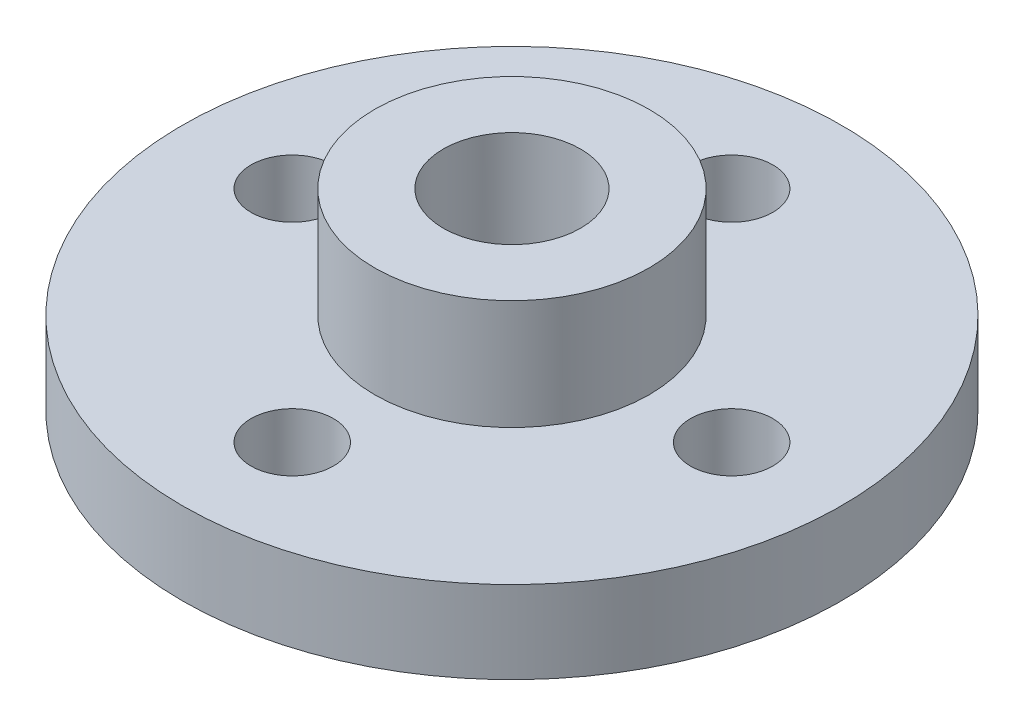
ISO-10303-21;
HEADER;
FILE_DESCRIPTION(('STEP AP214'),'2;1');
FILE_NAME('part.step','',(''),(''),'','','');
FILE_SCHEMA(('AUTOMOTIVE_DESIGN { 1 0 10303 214 1 1 1 1 }'));
ENDSEC;
DATA;
#1=APPLICATION_CONTEXT('core data for automotive mechanical design processes');
#2=APPLICATION_PROTOCOL_DEFINITION('international standard','automotive_design',2000,#1);
#3=PRODUCT_CONTEXT('',#1,'mechanical');
#4=PRODUCT('Part','Part','',(#3));
#5=PRODUCT_RELATED_PRODUCT_CATEGORY('part','',(#4));
#6=PRODUCT_DEFINITION_FORMATION('','',#4);
#7=PRODUCT_DEFINITION_CONTEXT('part definition',#1,'design');
#8=PRODUCT_DEFINITION('design','',#6,#7);
#9=PRODUCT_DEFINITION_SHAPE('','',#8);
#10=(LENGTH_UNIT() NAMED_UNIT(*) SI_UNIT(.MILLI.,.METRE.));
#11=(NAMED_UNIT(*) PLANE_ANGLE_UNIT() SI_UNIT($,.RADIAN.));
#12=(NAMED_UNIT(*) SI_UNIT($,.STERADIAN.) SOLID_ANGLE_UNIT());
#13=UNCERTAINTY_MEASURE_WITH_UNIT(LENGTH_MEASURE(1.E-05),#10,'distance_accuracy_value','');
#14=(GEOMETRIC_REPRESENTATION_CONTEXT(3) GLOBAL_UNCERTAINTY_ASSIGNED_CONTEXT((#13)) GLOBAL_UNIT_ASSIGNED_CONTEXT((#10,
#11,#12)) REPRESENTATION_CONTEXT('',''));
#15=CARTESIAN_POINT('',(0.,0.,0.));
#16=DIRECTION('',(0.,0.,1.));
#17=DIRECTION('',(1.,0.,0.));
#18=AXIS2_PLACEMENT_3D('',#15,#16,#17);
#19=CARTESIAN_POINT('',(0.,3.,0.));
#20=DIRECTION('',(0.,-1.,0.));
#21=DIRECTION('',(0.,0.,-1.));
#22=AXIS2_PLACEMENT_3D('',#19,#20,#21);
#23=CYLINDRICAL_SURFACE('',#22,12.);
#24=CARTESIAN_POINT('',(0.,3.,0.));
#25=DIRECTION('',(0.,1.,0.));
#26=DIRECTION('',(0.,0.,1.));
#27=AXIS2_PLACEMENT_3D('',#24,#25,#26);
#28=CIRCLE('',#27,12.);
#29=CARTESIAN_POINT('',(0.,3.,12.));
#30=VERTEX_POINT('',#29);
#31=EDGE_CURVE('E10',#30,#30,#28,.T.);
#32=ORIENTED_EDGE('',*,*,#31,.F.);
#33=EDGE_LOOP('',(#32));
#34=FACE_BOUND('',#33,.T.);
#35=CARTESIAN_POINT('',(0.,0.,0.));
#36=DIRECTION('',(0.,1.,0.));
#37=DIRECTION('',(0.,0.,1.));
#38=AXIS2_PLACEMENT_3D('',#35,#36,#37);
#39=CIRCLE('',#38,12.);
#40=CARTESIAN_POINT('',(0.,0.,12.));
#41=VERTEX_POINT('',#40);
#42=EDGE_CURVE('E38',#41,#41,#39,.T.);
#43=ORIENTED_EDGE('',*,*,#42,.T.);
#44=EDGE_LOOP('',(#43));
#45=FACE_BOUND('',#44,.T.);
#46=ADVANCED_FACE('F35',(#34,#45),#23,.T.);
#47=CARTESIAN_POINT('',(0.,3.,0.));
#48=DIRECTION('',(0.,1.,0.));
#49=DIRECTION('',(0.,0.,1.));
#50=AXIS2_PLACEMENT_3D('',#47,#48,#49);
#51=PLANE('',#50);
#52=CARTESIAN_POINT('',(-8.,3.,0.));
#53=DIRECTION('',(0.,1.,0.));
#54=DIRECTION('',(0.,0.,1.));
#55=AXIS2_PLACEMENT_3D('',#52,#53,#54);
#56=CIRCLE('',#55,1.5);
#57=CARTESIAN_POINT('',(-8.,3.,1.5));
#58=VERTEX_POINT('',#57);
#59=EDGE_CURVE('E77',#58,#58,#56,.F.);
#60=ORIENTED_EDGE('',*,*,#59,.T.);
#61=EDGE_LOOP('',(#60));
#62=FACE_BOUND('',#61,.T.);
#63=CARTESIAN_POINT('',(0.,3.,8.));
#64=DIRECTION('',(0.,1.,0.));
#65=DIRECTION('',(0.,0.,1.));
#66=AXIS2_PLACEMENT_3D('',#63,#64,#65);
#67=CIRCLE('',#66,1.5);
#68=CARTESIAN_POINT('',(0.,3.,9.5));
#69=VERTEX_POINT('',#68);
#70=EDGE_CURVE('E71',#69,#69,#67,.F.);
#71=ORIENTED_EDGE('',*,*,#70,.T.);
#72=EDGE_LOOP('',(#71));
#73=FACE_BOUND('',#72,.T.);
#74=CARTESIAN_POINT('',(8.,3.,0.));
#75=DIRECTION('',(0.,1.,0.));
#76=DIRECTION('',(0.,0.,1.));
#77=AXIS2_PLACEMENT_3D('',#74,#75,#76);
#78=CIRCLE('',#77,1.5);
#79=CARTESIAN_POINT('',(8.,3.,1.5));
#80=VERTEX_POINT('',#79);
#81=EDGE_CURVE('E65',#80,#80,#78,.F.);
#82=ORIENTED_EDGE('',*,*,#81,.T.);
#83=EDGE_LOOP('',(#82));
#84=FACE_BOUND('',#83,.T.);
#85=CARTESIAN_POINT('',(0.,3.,-8.));
#86=DIRECTION('',(0.,1.,0.));
#87=DIRECTION('',(0.,0.,1.));
#88=AXIS2_PLACEMENT_3D('',#85,#86,#87);
#89=CIRCLE('',#88,1.5);
#90=CARTESIAN_POINT('',(0.,3.,-6.5));
#91=VERTEX_POINT('',#90);
#92=EDGE_CURVE('E59',#91,#91,#89,.F.);
#93=ORIENTED_EDGE('',*,*,#92,.T.);
#94=EDGE_LOOP('',(#93));
#95=FACE_BOUND('',#94,.T.);
#96=CARTESIAN_POINT('',(0.,3.,0.));
#97=DIRECTION('',(0.,1.,0.));
#98=DIRECTION('',(0.,0.,1.));
#99=AXIS2_PLACEMENT_3D('',#96,#97,#98);
#100=CIRCLE('',#99,5.);
#101=CARTESIAN_POINT('',(0.,3.,5.));
#102=VERTEX_POINT('',#101);
#103=EDGE_CURVE('E47',#102,#102,#100,.T.);
#104=ORIENTED_EDGE('',*,*,#103,.F.);
#105=EDGE_LOOP('',(#104));
#106=FACE_BOUND('',#105,.T.);
#107=ORIENTED_EDGE('',*,*,#31,.T.);
#108=EDGE_LOOP('',(#107));
#109=FACE_BOUND('',#108,.T.);
#110=ADVANCED_FACE('F89',(#62,#73,#84,#95,#106,#109),#51,.T.);
#111=CARTESIAN_POINT('',(0.,0.,0.));
#112=DIRECTION('',(0.,1.,0.));
#113=DIRECTION('',(0.,0.,1.));
#114=AXIS2_PLACEMENT_3D('',#111,#112,#113);
#115=PLANE('',#114);
#116=CARTESIAN_POINT('',(-8.,0.,0.));
#117=DIRECTION('',(0.,-1.,0.));
#118=DIRECTION('',(0.,0.,-1.));
#119=AXIS2_PLACEMENT_3D('',#116,#117,#118);
#120=CIRCLE('',#119,1.5);
#121=CARTESIAN_POINT('',(-8.,0.,-1.5));
#122=VERTEX_POINT('',#121);
#123=EDGE_CURVE('E58',#122,#122,#120,.T.);
#124=ORIENTED_EDGE('',*,*,#123,.F.);
#125=EDGE_LOOP('',(#124));
#126=FACE_BOUND('',#125,.T.);
#127=CARTESIAN_POINT('',(0.,0.,8.));
#128=DIRECTION('',(0.,-1.,0.));
#129=DIRECTION('',(0.,0.,-1.));
#130=AXIS2_PLACEMENT_3D('',#127,#128,#129);
#131=CIRCLE('',#130,1.5);
#132=CARTESIAN_POINT('',(0.,0.,6.5));
#133=VERTEX_POINT('',#132);
#134=EDGE_CURVE('E74',#133,#133,#131,.T.);
#135=ORIENTED_EDGE('',*,*,#134,.F.);
#136=EDGE_LOOP('',(#135));
#137=FACE_BOUND('',#136,.T.);
#138=CARTESIAN_POINT('',(8.,0.,0.));
#139=DIRECTION('',(0.,-1.,0.));
#140=DIRECTION('',(0.,0.,-1.));
#141=AXIS2_PLACEMENT_3D('',#138,#139,#140);
#142=CIRCLE('',#141,1.5);
#143=CARTESIAN_POINT('',(8.,0.,-1.5));
#144=VERTEX_POINT('',#143);
#145=EDGE_CURVE('E68',#144,#144,#142,.T.);
#146=ORIENTED_EDGE('',*,*,#145,.F.);
#147=EDGE_LOOP('',(#146));
#148=FACE_BOUND('',#147,.T.);
#149=CARTESIAN_POINT('',(0.,0.,-8.));
#150=DIRECTION('',(0.,-1.,0.));
#151=DIRECTION('',(0.,0.,-1.));
#152=AXIS2_PLACEMENT_3D('',#149,#150,#151);
#153=CIRCLE('',#152,1.5);
#154=CARTESIAN_POINT('',(0.,0.,-9.5));
#155=VERTEX_POINT('',#154);
#156=EDGE_CURVE('E62',#155,#155,#153,.T.);
#157=ORIENTED_EDGE('',*,*,#156,.F.);
#158=EDGE_LOOP('',(#157));
#159=FACE_BOUND('',#158,.T.);
#160=CARTESIAN_POINT('',(0.,0.,0.));
#161=DIRECTION('',(0.,-1.,0.));
#162=DIRECTION('',(0.,0.,-1.));
#163=AXIS2_PLACEMENT_3D('',#160,#161,#162);
#164=CIRCLE('',#163,2.5);
#165=CARTESIAN_POINT('',(0.,0.,-2.5));
#166=VERTEX_POINT('',#165);
#167=EDGE_CURVE('E55',#166,#166,#164,.T.);
#168=ORIENTED_EDGE('',*,*,#167,.F.);
#169=EDGE_LOOP('',(#168));
#170=FACE_BOUND('',#169,.T.);
#171=ORIENTED_EDGE('',*,*,#42,.F.);
#172=EDGE_LOOP('',(#171));
#173=FACE_BOUND('',#172,.T.);
#174=ADVANCED_FACE('F85',(#126,#137,#148,#159,#170,#173),#115,.F.);
#175=CARTESIAN_POINT('',(0.,7.,0.));
#176=DIRECTION('',(0.,1.,0.));
#177=DIRECTION('',(0.,0.,1.));
#178=AXIS2_PLACEMENT_3D('',#175,#176,#177);
#179=PLANE('',#178);
#180=CARTESIAN_POINT('',(0.,7.,0.));
#181=DIRECTION('',(0.,1.,0.));
#182=DIRECTION('',(0.,0.,1.));
#183=AXIS2_PLACEMENT_3D('',#180,#181,#182);
#184=CIRCLE('',#183,5.);
#185=CARTESIAN_POINT('',(0.,7.,5.));
#186=VERTEX_POINT('',#185);
#187=EDGE_CURVE('E45',#186,#186,#184,.T.);
#188=ORIENTED_EDGE('',*,*,#187,.T.);
#189=EDGE_LOOP('',(#188));
#190=FACE_BOUND('',#189,.T.);
#191=CARTESIAN_POINT('',(0.,7.,0.));
#192=DIRECTION('',(0.,1.,0.));
#193=DIRECTION('',(0.,0.,1.));
#194=AXIS2_PLACEMENT_3D('',#191,#192,#193);
#195=CIRCLE('',#194,2.5);
#196=CARTESIAN_POINT('',(0.,7.,2.5));
#197=VERTEX_POINT('',#196);
#198=EDGE_CURVE('E50',#197,#197,#195,.T.);
#199=ORIENTED_EDGE('',*,*,#198,.F.);
#200=EDGE_LOOP('',(#199));
#201=FACE_BOUND('',#200,.T.);
#202=ADVANCED_FACE('F88',(#190,#201),#179,.T.);
#203=CARTESIAN_POINT('',(0.,7.,0.));
#204=DIRECTION('',(0.,-1.,0.));
#205=DIRECTION('',(0.,0.,-1.));
#206=AXIS2_PLACEMENT_3D('',#203,#204,#205);
#207=CYLINDRICAL_SURFACE('',#206,5.);
#208=ORIENTED_EDGE('',*,*,#187,.F.);
#209=EDGE_LOOP('',(#208));
#210=FACE_BOUND('',#209,.T.);
#211=ORIENTED_EDGE('',*,*,#103,.T.);
#212=EDGE_LOOP('',(#211));
#213=FACE_BOUND('',#212,.T.);
#214=ADVANCED_FACE('F111',(#210,#213),#207,.T.);
#215=CARTESIAN_POINT('',(0.,7.,0.));
#216=DIRECTION('',(0.,-1.,0.));
#217=DIRECTION('',(0.,0.,-1.));
#218=AXIS2_PLACEMENT_3D('',#215,#216,#217);
#219=CYLINDRICAL_SURFACE('',#218,2.5);
#220=ORIENTED_EDGE('',*,*,#198,.T.);
#221=EDGE_LOOP('',(#220));
#222=FACE_BOUND('',#221,.T.);
#223=ORIENTED_EDGE('',*,*,#167,.T.);
#224=EDGE_LOOP('',(#223));
#225=FACE_BOUND('',#224,.T.);
#226=ADVANCED_FACE('F114',(#222,#225),#219,.F.);
#227=CARTESIAN_POINT('',(0.,7.001,-8.));
#228=DIRECTION('',(0.,-1.,0.));
#229=DIRECTION('',(0.,0.,-1.));
#230=AXIS2_PLACEMENT_3D('',#227,#228,#229);
#231=CYLINDRICAL_SURFACE('',#230,1.5);
#232=ORIENTED_EDGE('',*,*,#92,.F.);
#233=EDGE_LOOP('',(#232));
#234=FACE_BOUND('',#233,.T.);
#235=ORIENTED_EDGE('',*,*,#156,.T.);
#236=EDGE_LOOP('',(#235));
#237=FACE_BOUND('',#236,.T.);
#238=ADVANCED_FACE('F121',(#234,#237),#231,.F.);
#239=CARTESIAN_POINT('',(8.,7.001,0.));
#240=DIRECTION('',(0.,-1.,0.));
#241=DIRECTION('',(0.,0.,-1.));
#242=AXIS2_PLACEMENT_3D('',#239,#240,#241);
#243=CYLINDRICAL_SURFACE('',#242,1.5);
#244=ORIENTED_EDGE('',*,*,#81,.F.);
#245=EDGE_LOOP('',(#244));
#246=FACE_BOUND('',#245,.T.);
#247=ORIENTED_EDGE('',*,*,#145,.T.);
#248=EDGE_LOOP('',(#247));
#249=FACE_BOUND('',#248,.T.);
#250=ADVANCED_FACE('F125',(#246,#249),#243,.F.);
#251=CARTESIAN_POINT('',(0.,7.001,8.));
#252=DIRECTION('',(0.,-1.,0.));
#253=DIRECTION('',(0.,0.,-1.));
#254=AXIS2_PLACEMENT_3D('',#251,#252,#253);
#255=CYLINDRICAL_SURFACE('',#254,1.5);
#256=ORIENTED_EDGE('',*,*,#70,.F.);
#257=EDGE_LOOP('',(#256));
#258=FACE_BOUND('',#257,.T.);
#259=ORIENTED_EDGE('',*,*,#134,.T.);
#260=EDGE_LOOP('',(#259));
#261=FACE_BOUND('',#260,.T.);
#262=ADVANCED_FACE('F129',(#258,#261),#255,.F.);
#263=CARTESIAN_POINT('',(-8.,7.001,0.));
#264=DIRECTION('',(0.,-1.,0.));
#265=DIRECTION('',(0.,0.,-1.));
#266=AXIS2_PLACEMENT_3D('',#263,#264,#265);
#267=CYLINDRICAL_SURFACE('',#266,1.5);
#268=ORIENTED_EDGE('',*,*,#59,.F.);
#269=EDGE_LOOP('',(#268));
#270=FACE_BOUND('',#269,.T.);
#271=ORIENTED_EDGE('',*,*,#123,.T.);
#272=EDGE_LOOP('',(#271));
#273=FACE_BOUND('',#272,.T.);
#274=ADVANCED_FACE('F83',(#270,#273),#267,.F.);
#275=CLOSED_SHELL('',(#46,#110,#174,#202,#214,#226,#238,#250,#262,#274));
#276=MANIFOLD_SOLID_BREP('B2',#275);
#277=ADVANCED_BREP_SHAPE_REPRESENTATION('',(#18,#276),#14);
#278=SHAPE_DEFINITION_REPRESENTATION(#9,#277);
ENDSEC;
END-ISO-10303-21;
